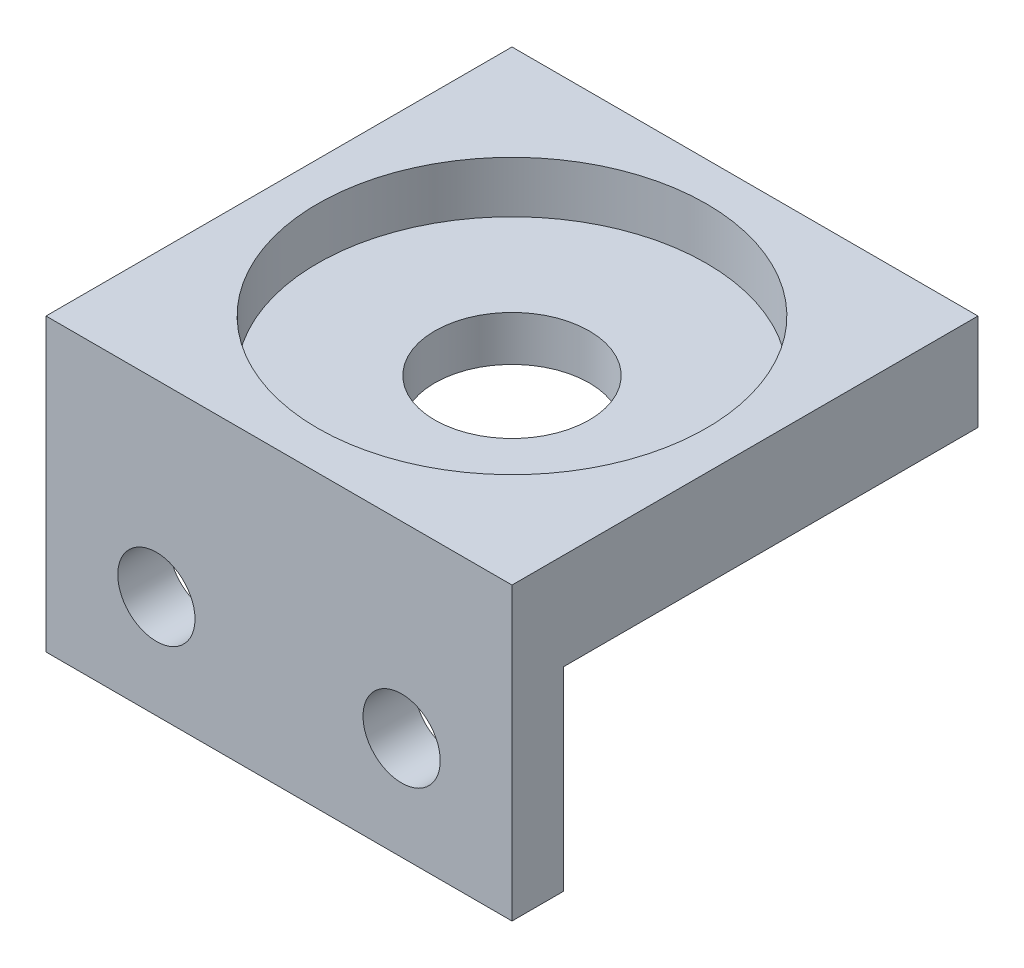
ISO-10303-21;
HEADER;
FILE_DESCRIPTION(('STEP AP214'),'2;1');
FILE_NAME('part.step','',(''),(''),'','','');
FILE_SCHEMA(('AUTOMOTIVE_DESIGN { 1 0 10303 214 1 1 1 1 }'));
ENDSEC;
DATA;
#1=APPLICATION_CONTEXT('core data for automotive mechanical design processes');
#2=APPLICATION_PROTOCOL_DEFINITION('international standard','automotive_design',2000,#1);
#3=PRODUCT_CONTEXT('',#1,'mechanical');
#4=PRODUCT('Part','Part','',(#3));
#5=PRODUCT_RELATED_PRODUCT_CATEGORY('part','',(#4));
#6=PRODUCT_DEFINITION_FORMATION('','',#4);
#7=PRODUCT_DEFINITION_CONTEXT('part definition',#1,'design');
#8=PRODUCT_DEFINITION('design','',#6,#7);
#9=PRODUCT_DEFINITION_SHAPE('','',#8);
#10=(LENGTH_UNIT() NAMED_UNIT(*) SI_UNIT(.MILLI.,.METRE.));
#11=(NAMED_UNIT(*) PLANE_ANGLE_UNIT() SI_UNIT($,.RADIAN.));
#12=(NAMED_UNIT(*) SI_UNIT($,.STERADIAN.) SOLID_ANGLE_UNIT());
#13=UNCERTAINTY_MEASURE_WITH_UNIT(LENGTH_MEASURE(1.E-05),#10,'distance_accuracy_value','');
#14=(GEOMETRIC_REPRESENTATION_CONTEXT(3) GLOBAL_UNCERTAINTY_ASSIGNED_CONTEXT((#13)) GLOBAL_UNIT_ASSIGNED_CONTEXT((#10,
#11,#12)) REPRESENTATION_CONTEXT('',''));
#15=CARTESIAN_POINT('',(0.,0.,0.));
#16=DIRECTION('',(0.,0.,1.));
#17=DIRECTION('',(1.,0.,0.));
#18=AXIS2_PLACEMENT_3D('',#15,#16,#17);
#19=CARTESIAN_POINT('',(0.,0.,0.));
#20=DIRECTION('',(0.,1.,0.));
#21=DIRECTION('',(0.,0.,1.));
#22=AXIS2_PLACEMENT_3D('',#19,#20,#21);
#23=PLANE('',#22);
#24=DIRECTION('',(0.,0.,1.));
#25=VECTOR('',#24,1.);
#26=CARTESIAN_POINT('',(1.,0.,-6.05));
#27=LINE('',#26,#25);
#28=CARTESIAN_POINT('',(1.,0.,-6.05));
#29=VERTEX_POINT('',#28);
#30=CARTESIAN_POINT('',(1.,0.,-2.));
#31=VERTEX_POINT('',#30);
#32=EDGE_CURVE('E118',#29,#31,#27,.T.);
#33=ORIENTED_EDGE('',*,*,#32,.F.);
#34=DIRECTION('',(-1.,0.,0.));
#35=VECTOR('',#34,1.);
#36=CARTESIAN_POINT('',(1.,0.,-6.05));
#37=LINE('',#36,#35);
#38=CARTESIAN_POINT('',(0.,0.,-6.05));
#39=VERTEX_POINT('',#38);
#40=EDGE_CURVE('E233',#29,#39,#37,.T.);
#41=ORIENTED_EDGE('',*,*,#40,.T.);
#42=CARTESIAN_POINT('',(0.,0.,-9.05));
#43=DIRECTION('',(0.,1.,0.));
#44=DIRECTION('',(0.,0.,1.));
#45=AXIS2_PLACEMENT_3D('',#42,#43,#44);
#46=CIRCLE('',#45,3.);
#47=EDGE_CURVE('E179',#39,#39,#46,.T.);
#48=ORIENTED_EDGE('',*,*,#47,.T.);
#49=CARTESIAN_POINT('',(-1.,0.,-6.05));
#50=VERTEX_POINT('',#49);
#51=EDGE_CURVE('E235',#39,#50,#37,.T.);
#52=ORIENTED_EDGE('',*,*,#51,.T.);
#53=DIRECTION('',(0.,0.,1.));
#54=VECTOR('',#53,1.);
#55=CARTESIAN_POINT('',(-1.,0.,-6.05));
#56=LINE('',#55,#54);
#57=CARTESIAN_POINT('',(-1.,0.,-2.));
#58=VERTEX_POINT('',#57);
#59=EDGE_CURVE('E238',#50,#58,#56,.T.);
#60=ORIENTED_EDGE('',*,*,#59,.T.);
#61=DIRECTION('',(1.,0.,0.));
#62=VECTOR('',#61,1.);
#63=CARTESIAN_POINT('',(0.,0.,-2.));
#64=LINE('',#63,#62);
#65=CARTESIAN_POINT('',(-9.05,0.,-2.));
#66=VERTEX_POINT('',#65);
#67=EDGE_CURVE('E68',#66,#58,#64,.T.);
#68=ORIENTED_EDGE('',*,*,#67,.F.);
#69=DIRECTION('',(0.,0.,-1.));
#70=VECTOR('',#69,1.);
#71=CARTESIAN_POINT('',(-9.05,0.,0.));
#72=LINE('',#71,#70);
#73=CARTESIAN_POINT('',(-9.05000000000001,0.,-18.1));
#74=VERTEX_POINT('',#73);
#75=EDGE_CURVE('E191',#66,#74,#72,.T.);
#76=ORIENTED_EDGE('',*,*,#75,.T.);
#77=DIRECTION('',(1.,0.,0.));
#78=VECTOR('',#77,1.);
#79=CARTESIAN_POINT('',(0.,0.,-18.1));
#80=LINE('',#79,#78);
#81=CARTESIAN_POINT('',(9.05,0.,-18.1));
#82=VERTEX_POINT('',#81);
#83=EDGE_CURVE('E189',#74,#82,#80,.T.);
#84=ORIENTED_EDGE('',*,*,#83,.T.);
#85=DIRECTION('',(0.,0.,-1.));
#86=VECTOR('',#85,1.);
#87=CARTESIAN_POINT('',(9.05,0.,0.));
#88=LINE('',#87,#86);
#89=CARTESIAN_POINT('',(9.05,0.,-2.));
#90=VERTEX_POINT('',#89);
#91=EDGE_CURVE('E138',#90,#82,#88,.T.);
#92=ORIENTED_EDGE('',*,*,#91,.F.);
#93=EDGE_CURVE('E132',#31,#90,#64,.T.);
#94=ORIENTED_EDGE('',*,*,#93,.F.);
#95=EDGE_LOOP('',(#33,#41,#48,#52,#60,#68,#76,#84,#92,#94));
#96=FACE_BOUND('',#95,.T.);
#97=ADVANCED_FACE('F45',(#96),#23,.F.);
#98=CARTESIAN_POINT('',(0.,0.,-2.));
#99=DIRECTION('',(0.,0.,1.));
#100=DIRECTION('',(1.,0.,0.));
#101=AXIS2_PLACEMENT_3D('',#98,#99,#100);
#102=PLANE('',#101);
#103=CARTESIAN_POINT('',(4.7625,-3.5525,-2.));
#104=DIRECTION('',(0.,0.,1.));
#105=DIRECTION('',(1.,0.,0.));
#106=AXIS2_PLACEMENT_3D('',#103,#104,#105);
#107=CIRCLE('',#106,1.5);
#108=CARTESIAN_POINT('',(6.2625,-3.5525,-2.));
#109=VERTEX_POINT('',#108);
#110=EDGE_CURVE('E160',#109,#109,#107,.T.);
#111=ORIENTED_EDGE('',*,*,#110,.T.);
#112=EDGE_LOOP('',(#111));
#113=FACE_BOUND('',#112,.T.);
#114=DIRECTION('',(0.,-1.,0.));
#115=VECTOR('',#114,1.);
#116=CARTESIAN_POINT('',(1.,0.,-2.));
#117=LINE('',#116,#115);
#118=CARTESIAN_POINT('',(1.,-7.5525,-2.));
#119=VERTEX_POINT('',#118);
#120=EDGE_CURVE('E121',#31,#119,#117,.T.);
#121=ORIENTED_EDGE('',*,*,#120,.F.);
#122=ORIENTED_EDGE('',*,*,#93,.T.);
#123=DIRECTION('',(0.,1.,0.));
#124=VECTOR('',#123,1.);
#125=CARTESIAN_POINT('',(9.05,0.,-2.));
#126=LINE('',#125,#124);
#127=CARTESIAN_POINT('',(9.05,-7.5525,-2.));
#128=VERTEX_POINT('',#127);
#129=EDGE_CURVE('E140',#128,#90,#126,.T.);
#130=ORIENTED_EDGE('',*,*,#129,.F.);
#131=DIRECTION('',(1.,0.,0.));
#132=VECTOR('',#131,1.);
#133=CARTESIAN_POINT('',(0.,-7.5525,-2.));
#134=LINE('',#133,#132);
#135=EDGE_CURVE('E134',#119,#128,#134,.T.);
#136=ORIENTED_EDGE('',*,*,#135,.F.);
#137=EDGE_LOOP('',(#121,#122,#130,#136));
#138=FACE_BOUND('',#137,.T.);
#139=ADVANCED_FACE('F130',(#113,#138),#102,.F.);
#140=CARTESIAN_POINT('',(0.,3.75,-9.05));
#141=DIRECTION('',(0.,-1.,0.));
#142=DIRECTION('',(0.,0.,-1.));
#143=AXIS2_PLACEMENT_3D('',#140,#141,#142);
#144=CYLINDRICAL_SURFACE('',#143,3.);
#145=ORIENTED_EDGE('',*,*,#47,.F.);
#146=EDGE_LOOP('',(#145));
#147=FACE_BOUND('',#146,.T.);
#148=CARTESIAN_POINT('',(0.,1.75,-9.05));
#149=DIRECTION('',(0.,1.,0.));
#150=DIRECTION('',(0.,0.,1.));
#151=AXIS2_PLACEMENT_3D('',#148,#149,#150);
#152=CIRCLE('',#151,3.);
#153=CARTESIAN_POINT('',(0.,1.75,-6.05));
#154=VERTEX_POINT('',#153);
#155=EDGE_CURVE('E164',#154,#154,#152,.T.);
#156=ORIENTED_EDGE('',*,*,#155,.T.);
#157=EDGE_LOOP('',(#156));
#158=FACE_BOUND('',#157,.T.);
#159=ADVANCED_FACE('F257',(#147,#158),#144,.F.);
#160=CARTESIAN_POINT('',(0.,3.75,0.));
#161=DIRECTION('',(0.,0.,-1.));
#162=DIRECTION('',(-1.,0.,0.));
#163=AXIS2_PLACEMENT_3D('',#160,#161,#162);
#164=PLANE('',#163);
#165=DIRECTION('',(0.,-1.,0.));
#166=VECTOR('',#165,1.);
#167=CARTESIAN_POINT('',(-9.05,3.75,0.));
#168=LINE('',#167,#166);
#169=CARTESIAN_POINT('',(-9.05,3.75,0.));
#170=VERTEX_POINT('',#169);
#171=CARTESIAN_POINT('',(-9.05,-7.5525,0.));
#172=VERTEX_POINT('',#171);
#173=EDGE_CURVE('E187',#170,#172,#168,.T.);
#174=ORIENTED_EDGE('',*,*,#173,.T.);
#175=DIRECTION('',(1.,0.,0.));
#176=VECTOR('',#175,1.);
#177=CARTESIAN_POINT('',(0.,-7.5525,0.));
#178=LINE('',#177,#176);
#179=CARTESIAN_POINT('',(9.05,-7.5525,0.));
#180=VERTEX_POINT('',#179);
#181=EDGE_CURVE('E157',#172,#180,#178,.T.);
#182=ORIENTED_EDGE('',*,*,#181,.T.);
#183=DIRECTION('',(0.,-1.,0.));
#184=VECTOR('',#183,1.);
#185=CARTESIAN_POINT('',(9.05,3.75,0.));
#186=LINE('',#185,#184);
#187=CARTESIAN_POINT('',(9.05,3.75,0.));
#188=VERTEX_POINT('',#187);
#189=EDGE_CURVE('E12',#188,#180,#186,.T.);
#190=ORIENTED_EDGE('',*,*,#189,.F.);
#191=DIRECTION('',(1.,0.,0.));
#192=VECTOR('',#191,1.);
#193=CARTESIAN_POINT('',(0.,3.75,0.));
#194=LINE('',#193,#192);
#195=EDGE_CURVE('E175',#170,#188,#194,.T.);
#196=ORIENTED_EDGE('',*,*,#195,.F.);
#197=EDGE_LOOP('',(#174,#182,#190,#196));
#198=FACE_BOUND('',#197,.T.);
#199=CARTESIAN_POINT('',(4.7625,-3.5525,0.));
#200=DIRECTION('',(0.,0.,1.));
#201=DIRECTION('',(1.,0.,0.));
#202=AXIS2_PLACEMENT_3D('',#199,#200,#201);
#203=CIRCLE('',#202,1.5);
#204=CARTESIAN_POINT('',(6.2625,-3.5525,0.));
#205=VERTEX_POINT('',#204);
#206=EDGE_CURVE('E150',#205,#205,#203,.T.);
#207=ORIENTED_EDGE('',*,*,#206,.F.);
#208=EDGE_LOOP('',(#207));
#209=FACE_BOUND('',#208,.T.);
#210=CARTESIAN_POINT('',(-4.7625,-3.5525,0.));
#211=DIRECTION('',(0.,0.,1.));
#212=DIRECTION('',(1.,0.,0.));
#213=AXIS2_PLACEMENT_3D('',#210,#211,#212);
#214=CIRCLE('',#213,1.5);
#215=CARTESIAN_POINT('',(-3.2625,-3.5525,0.));
#216=VERTEX_POINT('',#215);
#217=EDGE_CURVE('E153',#216,#216,#214,.T.);
#218=ORIENTED_EDGE('',*,*,#217,.F.);
#219=EDGE_LOOP('',(#218));
#220=FACE_BOUND('',#219,.T.);
#221=ADVANCED_FACE('F47',(#198,#209,#220),#164,.F.);
#222=CARTESIAN_POINT('',(9.05,3.75,0.));
#223=DIRECTION('',(-1.,0.,0.));
#224=DIRECTION('',(0.,0.,1.));
#225=AXIS2_PLACEMENT_3D('',#222,#223,#224);
#226=PLANE('',#225);
#227=ORIENTED_EDGE('',*,*,#189,.T.);
#228=DIRECTION('',(0.,0.,1.));
#229=VECTOR('',#228,1.);
#230=CARTESIAN_POINT('',(9.05,-7.5525,-2.));
#231=LINE('',#230,#229);
#232=EDGE_CURVE('E149',#128,#180,#231,.T.);
#233=ORIENTED_EDGE('',*,*,#232,.F.);
#234=ORIENTED_EDGE('',*,*,#129,.T.);
#235=ORIENTED_EDGE('',*,*,#91,.T.);
#236=DIRECTION('',(0.,-1.,0.));
#237=VECTOR('',#236,1.);
#238=CARTESIAN_POINT('',(9.05,3.75,-18.1));
#239=LINE('',#238,#237);
#240=CARTESIAN_POINT('',(9.05,3.75,-18.1));
#241=VERTEX_POINT('',#240);
#242=EDGE_CURVE('E53',#241,#82,#239,.T.);
#243=ORIENTED_EDGE('',*,*,#242,.F.);
#244=DIRECTION('',(0.,0.,-1.));
#245=VECTOR('',#244,1.);
#246=CARTESIAN_POINT('',(9.05,3.75,0.));
#247=LINE('',#246,#245);
#248=EDGE_CURVE('E178',#188,#241,#247,.T.);
#249=ORIENTED_EDGE('',*,*,#248,.F.);
#250=EDGE_LOOP('',(#227,#233,#234,#235,#243,#249));
#251=FACE_BOUND('',#250,.T.);
#252=ADVANCED_FACE('F213',(#251),#226,.F.);
#253=CARTESIAN_POINT('',(0.,3.75,-18.1));
#254=DIRECTION('',(0.,0.,-1.));
#255=DIRECTION('',(-1.,0.,0.));
#256=AXIS2_PLACEMENT_3D('',#253,#254,#255);
#257=PLANE('',#256);
#258=ORIENTED_EDGE('',*,*,#83,.F.);
#259=DIRECTION('',(0.,-1.,0.));
#260=VECTOR('',#259,1.);
#261=CARTESIAN_POINT('',(-9.05000000000001,3.75,-18.1));
#262=LINE('',#261,#260);
#263=CARTESIAN_POINT('',(-9.05000000000001,3.75,-18.1));
#264=VERTEX_POINT('',#263);
#265=EDGE_CURVE('E196',#264,#74,#262,.T.);
#266=ORIENTED_EDGE('',*,*,#265,.F.);
#267=DIRECTION('',(1.,0.,0.));
#268=VECTOR('',#267,1.);
#269=CARTESIAN_POINT('',(0.,3.75,-18.1));
#270=LINE('',#269,#268);
#271=EDGE_CURVE('E181',#264,#241,#270,.T.);
#272=ORIENTED_EDGE('',*,*,#271,.T.);
#273=ORIENTED_EDGE('',*,*,#242,.T.);
#274=EDGE_LOOP('',(#258,#266,#272,#273));
#275=FACE_BOUND('',#274,.T.);
#276=ADVANCED_FACE('F202',(#275),#257,.T.);
#277=CARTESIAN_POINT('',(-9.05,3.75,0.));
#278=DIRECTION('',(-1.,0.,0.));
#279=DIRECTION('',(0.,0.,1.));
#280=AXIS2_PLACEMENT_3D('',#277,#278,#279);
#281=PLANE('',#280);
#282=ORIENTED_EDGE('',*,*,#75,.F.);
#283=DIRECTION('',(0.,-1.,0.));
#284=VECTOR('',#283,1.);
#285=CARTESIAN_POINT('',(-9.05,0.,-2.));
#286=LINE('',#285,#284);
#287=CARTESIAN_POINT('',(-9.05,-7.5525,-2.));
#288=VERTEX_POINT('',#287);
#289=EDGE_CURVE('E142',#66,#288,#286,.T.);
#290=ORIENTED_EDGE('',*,*,#289,.T.);
#291=DIRECTION('',(0.,0.,1.));
#292=VECTOR('',#291,1.);
#293=CARTESIAN_POINT('',(-9.05,-7.5525,-2.));
#294=LINE('',#293,#292);
#295=EDGE_CURVE('E161',#288,#172,#294,.T.);
#296=ORIENTED_EDGE('',*,*,#295,.T.);
#297=ORIENTED_EDGE('',*,*,#173,.F.);
#298=DIRECTION('',(0.,0.,-1.));
#299=VECTOR('',#298,1.);
#300=CARTESIAN_POINT('',(-9.05,3.75,0.));
#301=LINE('',#300,#299);
#302=EDGE_CURVE('E184',#170,#264,#301,.T.);
#303=ORIENTED_EDGE('',*,*,#302,.T.);
#304=ORIENTED_EDGE('',*,*,#265,.T.);
#305=EDGE_LOOP('',(#282,#290,#296,#297,#303,#304));
#306=FACE_BOUND('',#305,.T.);
#307=ADVANCED_FACE('F207',(#306),#281,.T.);
#308=CARTESIAN_POINT('',(0.,3.75,0.));
#309=DIRECTION('',(0.,1.,0.));
#310=DIRECTION('',(0.,0.,1.));
#311=AXIS2_PLACEMENT_3D('',#308,#309,#310);
#312=PLANE('',#311);
#313=CARTESIAN_POINT('',(0.,3.75,-9.05));
#314=DIRECTION('',(0.,1.,0.));
#315=DIRECTION('',(0.,0.,1.));
#316=AXIS2_PLACEMENT_3D('',#313,#314,#315);
#317=CIRCLE('',#316,7.55);
#318=CARTESIAN_POINT('',(0.,3.75,-1.5));
#319=VERTEX_POINT('',#318);
#320=EDGE_CURVE('E169',#319,#319,#317,.T.);
#321=ORIENTED_EDGE('',*,*,#320,.F.);
#322=EDGE_LOOP('',(#321));
#323=FACE_BOUND('',#322,.T.);
#324=ORIENTED_EDGE('',*,*,#195,.T.);
#325=ORIENTED_EDGE('',*,*,#248,.T.);
#326=ORIENTED_EDGE('',*,*,#271,.F.);
#327=ORIENTED_EDGE('',*,*,#302,.F.);
#328=EDGE_LOOP('',(#324,#325,#326,#327));
#329=FACE_BOUND('',#328,.T.);
#330=ADVANCED_FACE('F210',(#323,#329),#312,.T.);
#331=CARTESIAN_POINT('',(0.,1.75,-9.05));
#332=DIRECTION('',(0.,1.,0.));
#333=DIRECTION('',(0.,0.,1.));
#334=AXIS2_PLACEMENT_3D('',#331,#332,#333);
#335=CYLINDRICAL_SURFACE('',#334,7.55);
#336=CARTESIAN_POINT('',(0.,1.75,-9.05));
#337=DIRECTION('',(0.,1.,0.));
#338=DIRECTION('',(0.,0.,1.));
#339=AXIS2_PLACEMENT_3D('',#336,#337,#338);
#340=CIRCLE('',#339,7.55);
#341=CARTESIAN_POINT('',(0.,1.75,-1.5));
#342=VERTEX_POINT('',#341);
#343=EDGE_CURVE('E170',#342,#342,#340,.T.);
#344=ORIENTED_EDGE('',*,*,#343,.F.);
#345=EDGE_LOOP('',(#344));
#346=FACE_BOUND('',#345,.T.);
#347=ORIENTED_EDGE('',*,*,#320,.T.);
#348=EDGE_LOOP('',(#347));
#349=FACE_BOUND('',#348,.T.);
#350=ADVANCED_FACE('F347',(#346,#349),#335,.F.);
#351=CARTESIAN_POINT('',(0.,1.75,-9.05));
#352=DIRECTION('',(0.,1.,0.));
#353=DIRECTION('',(0.,0.,1.));
#354=AXIS2_PLACEMENT_3D('',#351,#352,#353);
#355=PLANE('',#354);
#356=ORIENTED_EDGE('',*,*,#155,.F.);
#357=EDGE_LOOP('',(#356));
#358=FACE_BOUND('',#357,.T.);
#359=ORIENTED_EDGE('',*,*,#343,.T.);
#360=EDGE_LOOP('',(#359));
#361=FACE_BOUND('',#360,.T.);
#362=ADVANCED_FACE('F342',(#358,#361),#355,.T.);
#363=CARTESIAN_POINT('',(0.,-7.5525,-2.));
#364=DIRECTION('',(0.,-1.,0.));
#365=DIRECTION('',(0.,0.,-1.));
#366=AXIS2_PLACEMENT_3D('',#363,#364,#365);
#367=PLANE('',#366);
#368=ORIENTED_EDGE('',*,*,#181,.F.);
#369=ORIENTED_EDGE('',*,*,#295,.F.);
#370=CARTESIAN_POINT('',(-1.,-7.5525,-2.));
#371=VERTEX_POINT('',#370);
#372=EDGE_CURVE('E143',#288,#371,#134,.T.);
#373=ORIENTED_EDGE('',*,*,#372,.T.);
#374=DIRECTION('',(-1.,0.,0.));
#375=VECTOR('',#374,1.);
#376=CARTESIAN_POINT('',(1.,-7.5525,-2.));
#377=LINE('',#376,#375);
#378=EDGE_CURVE('E154',#119,#371,#377,.T.);
#379=ORIENTED_EDGE('',*,*,#378,.F.);
#380=ORIENTED_EDGE('',*,*,#135,.T.);
#381=ORIENTED_EDGE('',*,*,#232,.T.);
#382=EDGE_LOOP('',(#368,#369,#373,#379,#380,#381));
#383=FACE_BOUND('',#382,.T.);
#384=ADVANCED_FACE('F218',(#383),#367,.T.);
#385=CARTESIAN_POINT('',(-4.7625,-3.5525,-2.));
#386=DIRECTION('',(0.,0.,1.));
#387=DIRECTION('',(1.,0.,0.));
#388=AXIS2_PLACEMENT_3D('',#385,#386,#387);
#389=CYLINDRICAL_SURFACE('',#388,1.5);
#390=CARTESIAN_POINT('',(-4.7625,-3.5525,-2.));
#391=DIRECTION('',(0.,0.,1.));
#392=DIRECTION('',(1.,0.,0.));
#393=AXIS2_PLACEMENT_3D('',#390,#391,#392);
#394=CIRCLE('',#393,1.5);
#395=CARTESIAN_POINT('',(-3.2625,-3.5525,-2.));
#396=VERTEX_POINT('',#395);
#397=EDGE_CURVE('E226',#396,#396,#394,.T.);
#398=ORIENTED_EDGE('',*,*,#397,.F.);
#399=EDGE_LOOP('',(#398));
#400=FACE_BOUND('',#399,.T.);
#401=ORIENTED_EDGE('',*,*,#217,.T.);
#402=EDGE_LOOP('',(#401));
#403=FACE_BOUND('',#402,.T.);
#404=ADVANCED_FACE('F303',(#400,#403),#389,.F.);
#405=CARTESIAN_POINT('',(4.7625,-3.5525,-2.));
#406=DIRECTION('',(0.,0.,1.));
#407=DIRECTION('',(1.,0.,0.));
#408=AXIS2_PLACEMENT_3D('',#405,#406,#407);
#409=CYLINDRICAL_SURFACE('',#408,1.5);
#410=ORIENTED_EDGE('',*,*,#110,.F.);
#411=EDGE_LOOP('',(#410));
#412=FACE_BOUND('',#411,.T.);
#413=ORIENTED_EDGE('',*,*,#206,.T.);
#414=EDGE_LOOP('',(#413));
#415=FACE_BOUND('',#414,.T.);
#416=ADVANCED_FACE('F298',(#412,#415),#409,.F.);
#417=ORIENTED_EDGE('',*,*,#397,.T.);
#418=EDGE_LOOP('',(#417));
#419=FACE_BOUND('',#418,.T.);
#420=ORIENTED_EDGE('',*,*,#67,.T.);
#421=DIRECTION('',(0.,-1.,0.));
#422=VECTOR('',#421,1.);
#423=CARTESIAN_POINT('',(-1.,0.,-2.));
#424=LINE('',#423,#422);
#425=EDGE_CURVE('E225',#58,#371,#424,.T.);
#426=ORIENTED_EDGE('',*,*,#425,.T.);
#427=ORIENTED_EDGE('',*,*,#372,.F.);
#428=ORIENTED_EDGE('',*,*,#289,.F.);
#429=EDGE_LOOP('',(#420,#426,#427,#428));
#430=FACE_BOUND('',#429,.T.);
#431=ADVANCED_FACE('F224',(#419,#430),#102,.F.);
#432=CARTESIAN_POINT('',(1.,-7.5525,-11.0670069444444));
#433=DIRECTION('',(-1.,0.,0.));
#434=DIRECTION('',(0.,0.,1.));
#435=AXIS2_PLACEMENT_3D('',#432,#433,#434);
#436=CYLINDRICAL_SURFACE('',#435,9.06700694444445);
#437=CARTESIAN_POINT('',(-1.,-7.5525,-11.0670069444444));
#438=DIRECTION('',(-1.,0.,0.));
#439=DIRECTION('',(0.,0.,1.));
#440=AXIS2_PLACEMENT_3D('',#437,#438,#439);
#441=CIRCLE('',#440,9.06700694444445);
#442=EDGE_CURVE('E60',#371,#50,#441,.T.);
#443=ORIENTED_EDGE('',*,*,#442,.T.);
#444=ORIENTED_EDGE('',*,*,#51,.F.);
#445=ORIENTED_EDGE('',*,*,#40,.F.);
#446=CARTESIAN_POINT('',(1.,-7.5525,-11.0670069444444));
#447=DIRECTION('',(-1.,0.,0.));
#448=DIRECTION('',(0.,0.,1.));
#449=AXIS2_PLACEMENT_3D('',#446,#447,#448);
#450=CIRCLE('',#449,9.06700694444445);
#451=EDGE_CURVE('E123',#119,#29,#450,.T.);
#452=ORIENTED_EDGE('',*,*,#451,.F.);
#453=ORIENTED_EDGE('',*,*,#378,.T.);
#454=EDGE_LOOP('',(#443,#444,#445,#452,#453));
#455=FACE_BOUND('',#454,.T.);
#456=ADVANCED_FACE('F243',(#455),#436,.F.);
#457=CARTESIAN_POINT('',(1.,-7.5525,-11.0670069444444));
#458=DIRECTION('',(-1.,0.,0.));
#459=DIRECTION('',(0.,0.,1.));
#460=AXIS2_PLACEMENT_3D('',#457,#458,#459);
#461=PLANE('',#460);
#462=ORIENTED_EDGE('',*,*,#32,.T.);
#463=ORIENTED_EDGE('',*,*,#120,.T.);
#464=ORIENTED_EDGE('',*,*,#451,.T.);
#465=EDGE_LOOP('',(#462,#463,#464));
#466=FACE_BOUND('',#465,.T.);
#467=ADVANCED_FACE('F120',(#466),#461,.F.);
#468=CARTESIAN_POINT('',(-1.,-7.5525,-11.0670069444444));
#469=DIRECTION('',(-1.,0.,0.));
#470=DIRECTION('',(0.,0.,1.));
#471=AXIS2_PLACEMENT_3D('',#468,#469,#470);
#472=PLANE('',#471);
#473=ORIENTED_EDGE('',*,*,#59,.F.);
#474=ORIENTED_EDGE('',*,*,#442,.F.);
#475=ORIENTED_EDGE('',*,*,#425,.F.);
#476=EDGE_LOOP('',(#473,#474,#475));
#477=FACE_BOUND('',#476,.T.);
#478=ADVANCED_FACE('F244',(#477),#472,.T.);
#479=CLOSED_SHELL('',(#97,#139,#159,#221,#252,#276,#307,#330,#350,#362,#384,#404,#416,#431,#456,
#467,#478));
#480=MANIFOLD_SOLID_BREP('B2',#479);
#481=ADVANCED_BREP_SHAPE_REPRESENTATION('',(#18,#480),#14);
#482=SHAPE_DEFINITION_REPRESENTATION(#9,#481);
ENDSEC;
END-ISO-10303-21;
